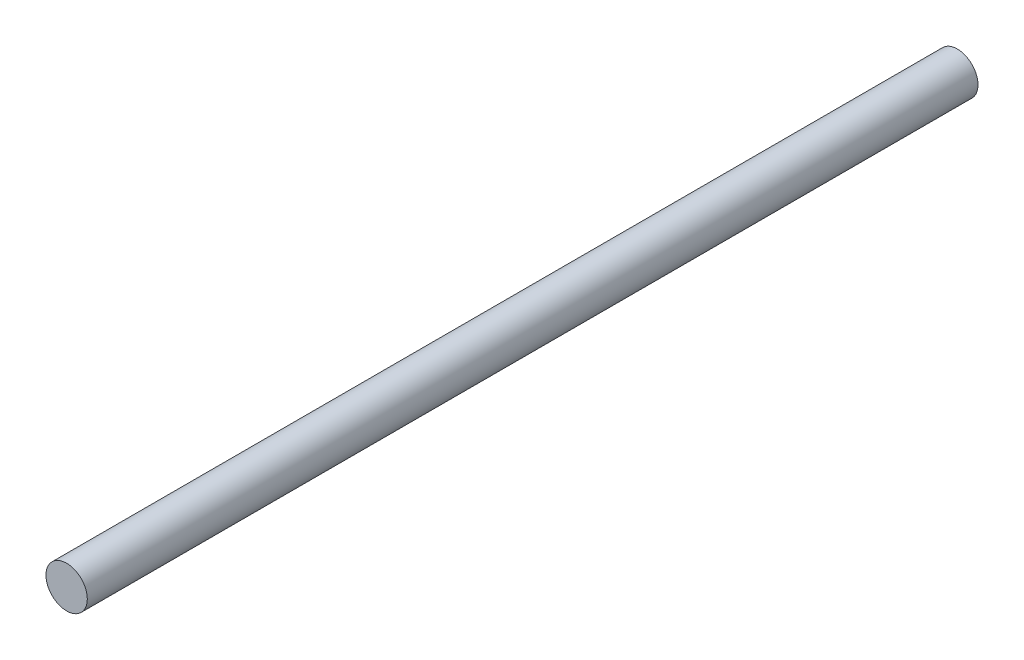
ISO-10303-21;
HEADER;
FILE_DESCRIPTION(('STEP AP214'),'2;1');
FILE_NAME('part.step','',(''),(''),'','','');
FILE_SCHEMA(('AUTOMOTIVE_DESIGN { 1 0 10303 214 1 1 1 1 }'));
ENDSEC;
DATA;
#1=APPLICATION_CONTEXT('core data for automotive mechanical design processes');
#2=APPLICATION_PROTOCOL_DEFINITION('international standard','automotive_design',2000,#1);
#3=PRODUCT_CONTEXT('',#1,'mechanical');
#4=PRODUCT('Part','Part','',(#3));
#5=PRODUCT_RELATED_PRODUCT_CATEGORY('part','',(#4));
#6=PRODUCT_DEFINITION_FORMATION('','',#4);
#7=PRODUCT_DEFINITION_CONTEXT('part definition',#1,'design');
#8=PRODUCT_DEFINITION('design','',#6,#7);
#9=PRODUCT_DEFINITION_SHAPE('','',#8);
#10=(LENGTH_UNIT() NAMED_UNIT(*) SI_UNIT(.MILLI.,.METRE.));
#11=(NAMED_UNIT(*) PLANE_ANGLE_UNIT() SI_UNIT($,.RADIAN.));
#12=(NAMED_UNIT(*) SI_UNIT($,.STERADIAN.) SOLID_ANGLE_UNIT());
#13=UNCERTAINTY_MEASURE_WITH_UNIT(LENGTH_MEASURE(1.E-05),#10,'distance_accuracy_value','');
#14=(GEOMETRIC_REPRESENTATION_CONTEXT(3) GLOBAL_UNCERTAINTY_ASSIGNED_CONTEXT((#13)) GLOBAL_UNIT_ASSIGNED_CONTEXT((#10,
#11,#12)) REPRESENTATION_CONTEXT('',''));
#15=CARTESIAN_POINT('',(0.,0.,0.));
#16=DIRECTION('',(0.,0.,1.));
#17=DIRECTION('',(1.,0.,0.));
#18=AXIS2_PLACEMENT_3D('',#15,#16,#17);
#19=CARTESIAN_POINT('',(0.,0.,140.));
#20=DIRECTION('',(0.,0.,-1.));
#21=DIRECTION('',(-1.,0.,0.));
#22=AXIS2_PLACEMENT_3D('',#19,#20,#21);
#23=CYLINDRICAL_SURFACE('',#22,3.25);
#24=CARTESIAN_POINT('',(0.,0.,140.));
#25=DIRECTION('',(0.,0.,1.));
#26=DIRECTION('',(1.,0.,0.));
#27=AXIS2_PLACEMENT_3D('',#24,#25,#26);
#28=CIRCLE('',#27,3.25);
#29=CARTESIAN_POINT('',(3.25,0.,140.));
#30=VERTEX_POINT('',#29);
#31=EDGE_CURVE('E10',#30,#30,#28,.T.);
#32=ORIENTED_EDGE('',*,*,#31,.F.);
#33=EDGE_LOOP('',(#32));
#34=FACE_BOUND('',#33,.T.);
#35=CARTESIAN_POINT('',(0.,0.,0.));
#36=DIRECTION('',(0.,0.,1.));
#37=DIRECTION('',(1.,0.,0.));
#38=AXIS2_PLACEMENT_3D('',#35,#36,#37);
#39=CIRCLE('',#38,3.25);
#40=CARTESIAN_POINT('',(3.25,0.,0.));
#41=VERTEX_POINT('',#40);
#42=EDGE_CURVE('E42',#41,#41,#39,.T.);
#43=ORIENTED_EDGE('',*,*,#42,.T.);
#44=EDGE_LOOP('',(#43));
#45=FACE_BOUND('',#44,.T.);
#46=ADVANCED_FACE('F39',(#34,#45),#23,.T.);
#47=CARTESIAN_POINT('',(0.,0.,140.));
#48=DIRECTION('',(0.,0.,1.));
#49=DIRECTION('',(1.,0.,0.));
#50=AXIS2_PLACEMENT_3D('',#47,#48,#49);
#51=PLANE('',#50);
#52=ORIENTED_EDGE('',*,*,#31,.T.);
#53=EDGE_LOOP('',(#52));
#54=FACE_BOUND('',#53,.T.);
#55=ADVANCED_FACE('F54',(#54),#51,.T.);
#56=CARTESIAN_POINT('',(0.,0.,0.));
#57=DIRECTION('',(0.,0.,1.));
#58=DIRECTION('',(1.,0.,0.));
#59=AXIS2_PLACEMENT_3D('',#56,#57,#58);
#60=PLANE('',#59);
#61=ORIENTED_EDGE('',*,*,#42,.F.);
#62=EDGE_LOOP('',(#61));
#63=FACE_BOUND('',#62,.T.);
#64=ADVANCED_FACE('F52',(#63),#60,.F.);
#65=CLOSED_SHELL('',(#46,#55,#64));
#66=MANIFOLD_SOLID_BREP('B2',#65);
#67=ADVANCED_BREP_SHAPE_REPRESENTATION('',(#18,#66),#14);
#68=SHAPE_DEFINITION_REPRESENTATION(#9,#67);
ENDSEC;
END-ISO-10303-21;
